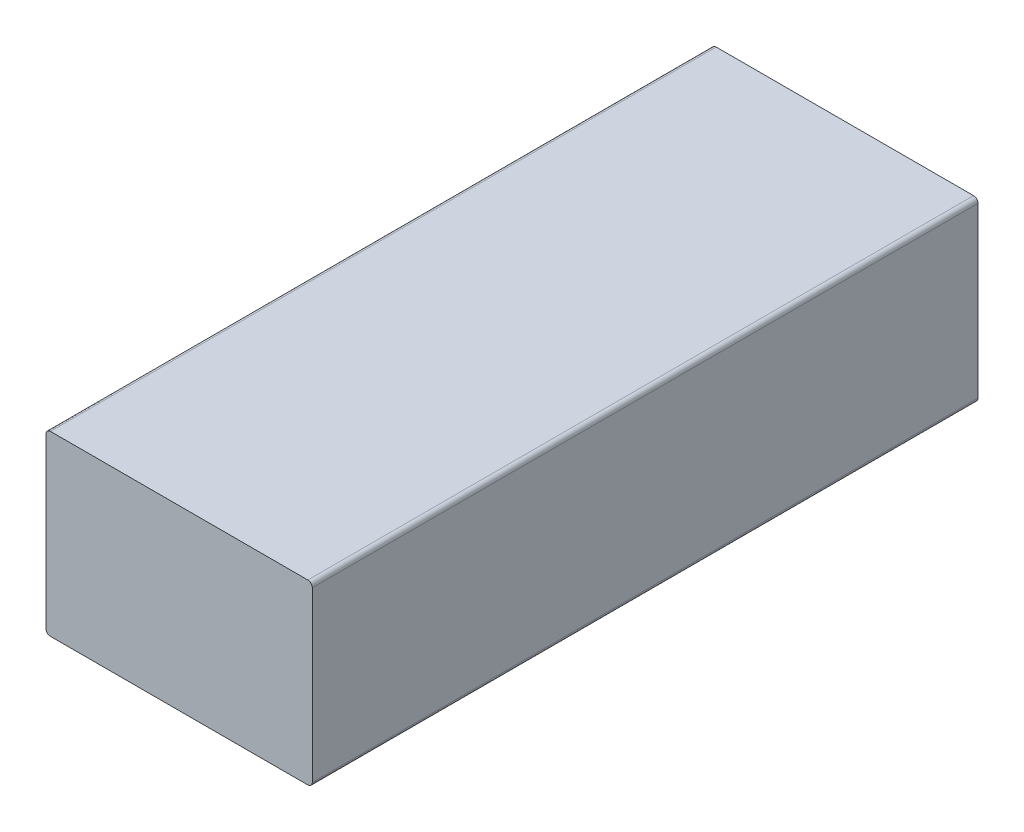
ISO-10303-21;
HEADER;
FILE_DESCRIPTION(('STEP AP214'),'2;1');
FILE_NAME('part.step','',(''),(''),'','','');
FILE_SCHEMA(('AUTOMOTIVE_DESIGN { 1 0 10303 214 1 1 1 1 }'));
ENDSEC;
DATA;
#1=APPLICATION_CONTEXT('core data for automotive mechanical design processes');
#2=APPLICATION_PROTOCOL_DEFINITION('international standard','automotive_design',2000,#1);
#3=PRODUCT_CONTEXT('',#1,'mechanical');
#4=PRODUCT('Part','Part','',(#3));
#5=PRODUCT_RELATED_PRODUCT_CATEGORY('part','',(#4));
#6=PRODUCT_DEFINITION_FORMATION('','',#4);
#7=PRODUCT_DEFINITION_CONTEXT('part definition',#1,'design');
#8=PRODUCT_DEFINITION('design','',#6,#7);
#9=PRODUCT_DEFINITION_SHAPE('','',#8);
#10=(LENGTH_UNIT() NAMED_UNIT(*) SI_UNIT(.MILLI.,.METRE.));
#11=(NAMED_UNIT(*) PLANE_ANGLE_UNIT() SI_UNIT($,.RADIAN.));
#12=(NAMED_UNIT(*) SI_UNIT($,.STERADIAN.) SOLID_ANGLE_UNIT());
#13=UNCERTAINTY_MEASURE_WITH_UNIT(LENGTH_MEASURE(1.E-05),#10,'distance_accuracy_value','');
#14=(GEOMETRIC_REPRESENTATION_CONTEXT(3) GLOBAL_UNCERTAINTY_ASSIGNED_CONTEXT((#13)) GLOBAL_UNIT_ASSIGNED_CONTEXT((#10,
#11,#12)) REPRESENTATION_CONTEXT('',''));
#15=CARTESIAN_POINT('',(0.,0.,0.));
#16=DIRECTION('',(0.,0.,1.));
#17=DIRECTION('',(1.,0.,0.));
#18=AXIS2_PLACEMENT_3D('',#15,#16,#17);
#19=CARTESIAN_POINT('',(3.,-2.,15.));
#20=DIRECTION('',(-1.,0.,0.));
#21=DIRECTION('',(0.,0.,1.));
#22=AXIS2_PLACEMENT_3D('',#19,#20,#21);
#23=PLANE('',#22);
#24=DIRECTION('',(0.,1.,0.));
#25=VECTOR('',#24,1.);
#26=CARTESIAN_POINT('',(3.,-2.,15.));
#27=LINE('',#26,#25);
#28=CARTESIAN_POINT('',(3.,-1.9,15.));
#29=VERTEX_POINT('',#28);
#30=CARTESIAN_POINT('',(3.,1.9,15.));
#31=VERTEX_POINT('',#30);
#32=EDGE_CURVE('E126',#29,#31,#27,.T.);
#33=ORIENTED_EDGE('',*,*,#32,.F.);
#34=DIRECTION('',(0.,0.,-1.));
#35=VECTOR('',#34,1.);
#36=CARTESIAN_POINT('',(3.,-1.9,15.));
#37=LINE('',#36,#35);
#38=CARTESIAN_POINT('',(3.,-1.9,0.));
#39=VERTEX_POINT('',#38);
#40=EDGE_CURVE('E152',#29,#39,#37,.T.);
#41=ORIENTED_EDGE('',*,*,#40,.T.);
#42=DIRECTION('',(0.,1.,0.));
#43=VECTOR('',#42,1.);
#44=CARTESIAN_POINT('',(3.,-2.,0.));
#45=LINE('',#44,#43);
#46=CARTESIAN_POINT('',(3.,1.9,0.));
#47=VERTEX_POINT('',#46);
#48=EDGE_CURVE('E160',#39,#47,#45,.T.);
#49=ORIENTED_EDGE('',*,*,#48,.T.);
#50=DIRECTION('',(0.,0.,-1.));
#51=VECTOR('',#50,1.);
#52=CARTESIAN_POINT('',(3.,1.9,15.));
#53=LINE('',#52,#51);
#54=EDGE_CURVE('E150',#47,#31,#53,.F.);
#55=ORIENTED_EDGE('',*,*,#54,.T.);
#56=EDGE_LOOP('',(#33,#41,#49,#55));
#57=FACE_BOUND('',#56,.T.);
#58=ADVANCED_FACE('F35',(#57),#23,.F.);
#59=CARTESIAN_POINT('',(-3.,2.,15.));
#60=DIRECTION('',(0.,-1.,0.));
#61=DIRECTION('',(0.,0.,-1.));
#62=AXIS2_PLACEMENT_3D('',#59,#60,#61);
#63=PLANE('',#62);
#64=DIRECTION('',(-1.,0.,0.));
#65=VECTOR('',#64,1.);
#66=CARTESIAN_POINT('',(-3.,2.,0.));
#67=LINE('',#66,#65);
#68=CARTESIAN_POINT('',(2.9,2.,0.));
#69=VERTEX_POINT('',#68);
#70=CARTESIAN_POINT('',(-2.9,2.,0.));
#71=VERTEX_POINT('',#70);
#72=EDGE_CURVE('E131',#69,#71,#67,.T.);
#73=ORIENTED_EDGE('',*,*,#72,.T.);
#74=DIRECTION('',(0.,0.,-1.));
#75=VECTOR('',#74,1.);
#76=CARTESIAN_POINT('',(-2.9,2.,15.));
#77=LINE('',#76,#75);
#78=CARTESIAN_POINT('',(-2.9,2.,15.));
#79=VERTEX_POINT('',#78);
#80=EDGE_CURVE('E11',#71,#79,#77,.F.);
#81=ORIENTED_EDGE('',*,*,#80,.T.);
#82=DIRECTION('',(-1.,0.,0.));
#83=VECTOR('',#82,1.);
#84=CARTESIAN_POINT('',(-3.,2.,15.));
#85=LINE('',#84,#83);
#86=CARTESIAN_POINT('',(2.9,2.,15.));
#87=VERTEX_POINT('',#86);
#88=EDGE_CURVE('E129',#87,#79,#85,.T.);
#89=ORIENTED_EDGE('',*,*,#88,.F.);
#90=DIRECTION('',(0.,0.,-1.));
#91=VECTOR('',#90,1.);
#92=CARTESIAN_POINT('',(2.9,2.,15.));
#93=LINE('',#92,#91);
#94=EDGE_CURVE('E43',#87,#69,#93,.T.);
#95=ORIENTED_EDGE('',*,*,#94,.T.);
#96=EDGE_LOOP('',(#73,#81,#89,#95));
#97=FACE_BOUND('',#96,.T.);
#98=ADVANCED_FACE('F157',(#97),#63,.F.);
#99=CARTESIAN_POINT('',(-3.,-2.,15.));
#100=DIRECTION('',(1.,0.,0.));
#101=DIRECTION('',(0.,0.,-1.));
#102=AXIS2_PLACEMENT_3D('',#99,#100,#101);
#103=PLANE('',#102);
#104=DIRECTION('',(0.,-1.,0.));
#105=VECTOR('',#104,1.);
#106=CARTESIAN_POINT('',(-3.,-2.,0.));
#107=LINE('',#106,#105);
#108=CARTESIAN_POINT('',(-3.,1.9,0.));
#109=VERTEX_POINT('',#108);
#110=CARTESIAN_POINT('',(-3.,-1.9,0.));
#111=VERTEX_POINT('',#110);
#112=EDGE_CURVE('E127',#109,#111,#107,.T.);
#113=ORIENTED_EDGE('',*,*,#112,.T.);
#114=DIRECTION('',(0.,0.,-1.));
#115=VECTOR('',#114,1.);
#116=CARTESIAN_POINT('',(-3.,-1.9,15.));
#117=LINE('',#116,#115);
#118=CARTESIAN_POINT('',(-3.,-1.9,15.));
#119=VERTEX_POINT('',#118);
#120=EDGE_CURVE('E105',#111,#119,#117,.F.);
#121=ORIENTED_EDGE('',*,*,#120,.T.);
#122=DIRECTION('',(0.,-1.,0.));
#123=VECTOR('',#122,1.);
#124=CARTESIAN_POINT('',(-3.,-2.,15.));
#125=LINE('',#124,#123);
#126=CARTESIAN_POINT('',(-3.,1.9,15.));
#127=VERTEX_POINT('',#126);
#128=EDGE_CURVE('E164',#127,#119,#125,.T.);
#129=ORIENTED_EDGE('',*,*,#128,.F.);
#130=DIRECTION('',(0.,0.,-1.));
#131=VECTOR('',#130,1.);
#132=CARTESIAN_POINT('',(-3.,1.9,15.));
#133=LINE('',#132,#131);
#134=EDGE_CURVE('E110',#127,#109,#133,.T.);
#135=ORIENTED_EDGE('',*,*,#134,.T.);
#136=EDGE_LOOP('',(#113,#121,#129,#135));
#137=FACE_BOUND('',#136,.T.);
#138=ADVANCED_FACE('F174',(#137),#103,.F.);
#139=CARTESIAN_POINT('',(-3.,-2.,15.));
#140=DIRECTION('',(0.,1.,0.));
#141=DIRECTION('',(0.,0.,1.));
#142=AXIS2_PLACEMENT_3D('',#139,#140,#141);
#143=PLANE('',#142);
#144=DIRECTION('',(1.,0.,0.));
#145=VECTOR('',#144,1.);
#146=CARTESIAN_POINT('',(-3.,-2.,15.));
#147=LINE('',#146,#145);
#148=CARTESIAN_POINT('',(-2.9,-2.,15.));
#149=VERTEX_POINT('',#148);
#150=CARTESIAN_POINT('',(2.9,-2.,15.));
#151=VERTEX_POINT('',#150);
#152=EDGE_CURVE('E120',#149,#151,#147,.T.);
#153=ORIENTED_EDGE('',*,*,#152,.F.);
#154=DIRECTION('',(0.,0.,-1.));
#155=VECTOR('',#154,1.);
#156=CARTESIAN_POINT('',(-2.9,-2.,15.));
#157=LINE('',#156,#155);
#158=CARTESIAN_POINT('',(-2.9,-2.,0.));
#159=VERTEX_POINT('',#158);
#160=EDGE_CURVE('E104',#149,#159,#157,.T.);
#161=ORIENTED_EDGE('',*,*,#160,.T.);
#162=DIRECTION('',(1.,0.,0.));
#163=VECTOR('',#162,1.);
#164=CARTESIAN_POINT('',(-3.,-2.,0.));
#165=LINE('',#164,#163);
#166=CARTESIAN_POINT('',(2.9,-2.,0.));
#167=VERTEX_POINT('',#166);
#168=EDGE_CURVE('E117',#159,#167,#165,.T.);
#169=ORIENTED_EDGE('',*,*,#168,.T.);
#170=DIRECTION('',(0.,0.,-1.));
#171=VECTOR('',#170,1.);
#172=CARTESIAN_POINT('',(2.9,-2.,15.));
#173=LINE('',#172,#171);
#174=EDGE_CURVE('E122',#167,#151,#173,.F.);
#175=ORIENTED_EDGE('',*,*,#174,.T.);
#176=EDGE_LOOP('',(#153,#161,#169,#175));
#177=FACE_BOUND('',#176,.T.);
#178=ADVANCED_FACE('F116',(#177),#143,.F.);
#179=CARTESIAN_POINT('',(0.,0.,15.));
#180=DIRECTION('',(0.,0.,-1.));
#181=DIRECTION('',(-1.,0.,0.));
#182=AXIS2_PLACEMENT_3D('',#179,#180,#181);
#183=PLANE('',#182);
#184=ORIENTED_EDGE('',*,*,#128,.T.);
#185=CARTESIAN_POINT('',(-2.9,-1.9,15.));
#186=DIRECTION('',(0.,0.,-1.));
#187=DIRECTION('',(-1.,0.,0.));
#188=AXIS2_PLACEMENT_3D('',#185,#186,#187);
#189=CIRCLE('',#188,0.1);
#190=EDGE_CURVE('E148',#119,#149,#189,.F.);
#191=ORIENTED_EDGE('',*,*,#190,.T.);
#192=ORIENTED_EDGE('',*,*,#152,.T.);
#193=CARTESIAN_POINT('',(2.9,-1.9,15.));
#194=DIRECTION('',(0.,0.,-1.));
#195=DIRECTION('',(-1.,0.,0.));
#196=AXIS2_PLACEMENT_3D('',#193,#194,#195);
#197=CIRCLE('',#196,0.1);
#198=EDGE_CURVE('E146',#151,#29,#197,.F.);
#199=ORIENTED_EDGE('',*,*,#198,.T.);
#200=ORIENTED_EDGE('',*,*,#32,.T.);
#201=CARTESIAN_POINT('',(2.9,1.9,15.));
#202=DIRECTION('',(0.,0.,-1.));
#203=DIRECTION('',(-1.,0.,0.));
#204=AXIS2_PLACEMENT_3D('',#201,#202,#203);
#205=CIRCLE('',#204,0.1);
#206=EDGE_CURVE('E55',#31,#87,#205,.F.);
#207=ORIENTED_EDGE('',*,*,#206,.T.);
#208=ORIENTED_EDGE('',*,*,#88,.T.);
#209=CARTESIAN_POINT('',(-2.9,1.9,15.));
#210=DIRECTION('',(0.,0.,-1.));
#211=DIRECTION('',(-1.,0.,0.));
#212=AXIS2_PLACEMENT_3D('',#209,#210,#211);
#213=CIRCLE('',#212,0.1);
#214=EDGE_CURVE('E144',#79,#127,#213,.F.);
#215=ORIENTED_EDGE('',*,*,#214,.T.);
#216=EDGE_LOOP('',(#184,#191,#192,#199,#200,#207,#208,#215));
#217=FACE_BOUND('',#216,.T.);
#218=ADVANCED_FACE('F168',(#217),#183,.F.);
#219=CARTESIAN_POINT('',(0.,0.,0.));
#220=DIRECTION('',(0.,0.,-1.));
#221=DIRECTION('',(-1.,0.,0.));
#222=AXIS2_PLACEMENT_3D('',#219,#220,#221);
#223=PLANE('',#222);
#224=ORIENTED_EDGE('',*,*,#168,.F.);
#225=CARTESIAN_POINT('',(-2.9,-1.9,0.));
#226=DIRECTION('',(0.,0.,-1.));
#227=DIRECTION('',(-1.,0.,0.));
#228=AXIS2_PLACEMENT_3D('',#225,#226,#227);
#229=CIRCLE('',#228,0.1);
#230=EDGE_CURVE('E100',#159,#111,#229,.T.);
#231=ORIENTED_EDGE('',*,*,#230,.T.);
#232=ORIENTED_EDGE('',*,*,#112,.F.);
#233=CARTESIAN_POINT('',(-2.9,1.9,0.));
#234=DIRECTION('',(0.,0.,-1.));
#235=DIRECTION('',(-1.,0.,0.));
#236=AXIS2_PLACEMENT_3D('',#233,#234,#235);
#237=CIRCLE('',#236,0.1);
#238=EDGE_CURVE('E137',#109,#71,#237,.T.);
#239=ORIENTED_EDGE('',*,*,#238,.T.);
#240=ORIENTED_EDGE('',*,*,#72,.F.);
#241=CARTESIAN_POINT('',(2.9,1.9,0.));
#242=DIRECTION('',(0.,0.,-1.));
#243=DIRECTION('',(-1.,0.,0.));
#244=AXIS2_PLACEMENT_3D('',#241,#242,#243);
#245=CIRCLE('',#244,0.1);
#246=EDGE_CURVE('E121',#69,#47,#245,.T.);
#247=ORIENTED_EDGE('',*,*,#246,.T.);
#248=ORIENTED_EDGE('',*,*,#48,.F.);
#249=CARTESIAN_POINT('',(2.9,-1.9,0.));
#250=DIRECTION('',(0.,0.,-1.));
#251=DIRECTION('',(-1.,0.,0.));
#252=AXIS2_PLACEMENT_3D('',#249,#250,#251);
#253=CIRCLE('',#252,0.1);
#254=EDGE_CURVE('E111',#39,#167,#253,.T.);
#255=ORIENTED_EDGE('',*,*,#254,.T.);
#256=EDGE_LOOP('',(#224,#231,#232,#239,#240,#247,#248,#255));
#257=FACE_BOUND('',#256,.T.);
#258=ADVANCED_FACE('F124',(#257),#223,.T.);
#259=CARTESIAN_POINT('',(-2.9,-1.9,15.));
#260=DIRECTION('',(0.,0.,-1.));
#261=DIRECTION('',(-1.,0.,0.));
#262=AXIS2_PLACEMENT_3D('',#259,#260,#261);
#263=CYLINDRICAL_SURFACE('',#262,0.1);
#264=ORIENTED_EDGE('',*,*,#190,.F.);
#265=ORIENTED_EDGE('',*,*,#120,.F.);
#266=ORIENTED_EDGE('',*,*,#230,.F.);
#267=ORIENTED_EDGE('',*,*,#160,.F.);
#268=EDGE_LOOP('',(#264,#265,#266,#267));
#269=FACE_BOUND('',#268,.T.);
#270=ADVANCED_FACE('F103',(#269),#263,.T.);
#271=CARTESIAN_POINT('',(2.9,-1.9,15.));
#272=DIRECTION('',(0.,0.,-1.));
#273=DIRECTION('',(-1.,0.,0.));
#274=AXIS2_PLACEMENT_3D('',#271,#272,#273);
#275=CYLINDRICAL_SURFACE('',#274,0.1);
#276=ORIENTED_EDGE('',*,*,#198,.F.);
#277=ORIENTED_EDGE('',*,*,#174,.F.);
#278=ORIENTED_EDGE('',*,*,#254,.F.);
#279=ORIENTED_EDGE('',*,*,#40,.F.);
#280=EDGE_LOOP('',(#276,#277,#278,#279));
#281=FACE_BOUND('',#280,.T.);
#282=ADVANCED_FACE('F179',(#281),#275,.T.);
#283=CARTESIAN_POINT('',(-2.9,1.9,15.));
#284=DIRECTION('',(0.,0.,-1.));
#285=DIRECTION('',(-1.,0.,0.));
#286=AXIS2_PLACEMENT_3D('',#283,#284,#285);
#287=CYLINDRICAL_SURFACE('',#286,0.1);
#288=ORIENTED_EDGE('',*,*,#214,.F.);
#289=ORIENTED_EDGE('',*,*,#80,.F.);
#290=ORIENTED_EDGE('',*,*,#238,.F.);
#291=ORIENTED_EDGE('',*,*,#134,.F.);
#292=EDGE_LOOP('',(#288,#289,#290,#291));
#293=FACE_BOUND('',#292,.T.);
#294=ADVANCED_FACE('F172',(#293),#287,.T.);
#295=CARTESIAN_POINT('',(2.9,1.9,15.));
#296=DIRECTION('',(0.,0.,-1.));
#297=DIRECTION('',(-1.,0.,0.));
#298=AXIS2_PLACEMENT_3D('',#295,#296,#297);
#299=CYLINDRICAL_SURFACE('',#298,0.1);
#300=ORIENTED_EDGE('',*,*,#206,.F.);
#301=ORIENTED_EDGE('',*,*,#54,.F.);
#302=ORIENTED_EDGE('',*,*,#246,.F.);
#303=ORIENTED_EDGE('',*,*,#94,.F.);
#304=EDGE_LOOP('',(#300,#301,#302,#303));
#305=FACE_BOUND('',#304,.T.);
#306=ADVANCED_FACE('F37',(#305),#299,.T.);
#307=CLOSED_SHELL('',(#58,#98,#138,#178,#218,#258,#270,#282,#294,#306));
#308=MANIFOLD_SOLID_BREP('B2',#307);
#309=ADVANCED_BREP_SHAPE_REPRESENTATION('',(#18,#308),#14);
#310=SHAPE_DEFINITION_REPRESENTATION(#9,#309);
ENDSEC;
END-ISO-10303-21;
